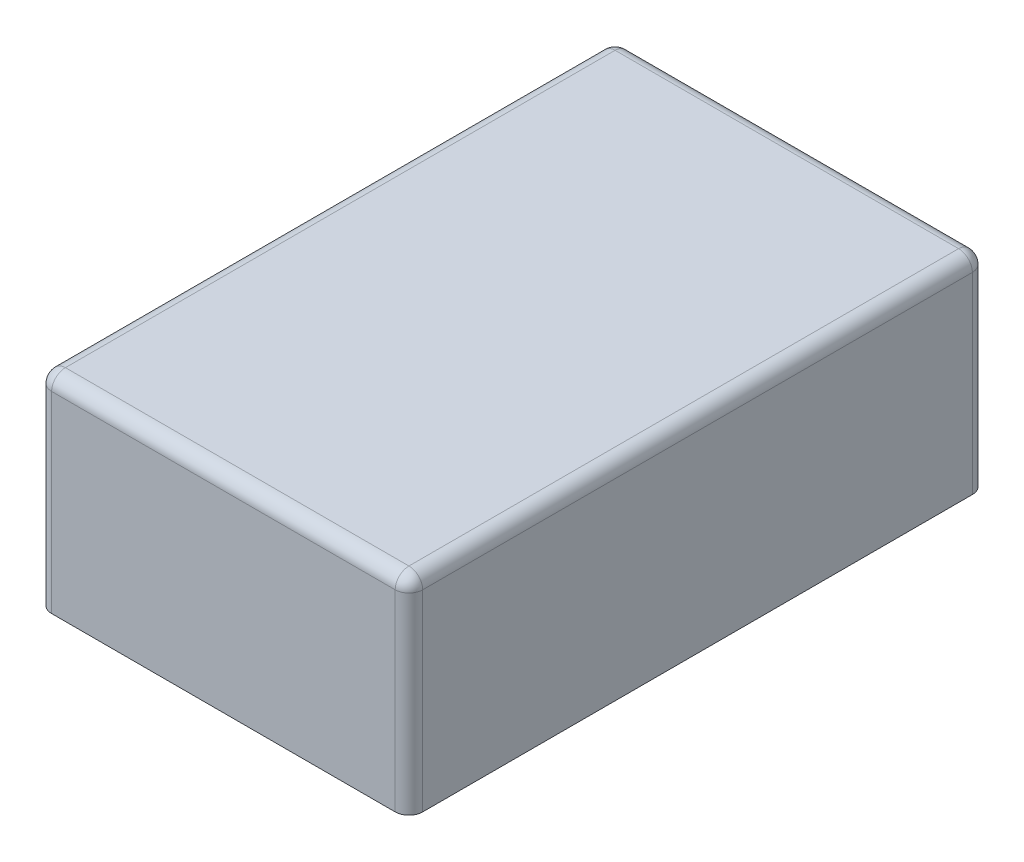
ISO-10303-21;
HEADER;
FILE_DESCRIPTION(('STEP AP214'),'2;1');
FILE_NAME('part.step','',(''),(''),'','','');
FILE_SCHEMA(('AUTOMOTIVE_DESIGN { 1 0 10303 214 1 1 1 1 }'));
ENDSEC;
DATA;
#1=APPLICATION_CONTEXT('core data for automotive mechanical design processes');
#2=APPLICATION_PROTOCOL_DEFINITION('international standard','automotive_design',2000,#1);
#3=PRODUCT_CONTEXT('',#1,'mechanical');
#4=PRODUCT('Part','Part','',(#3));
#5=PRODUCT_RELATED_PRODUCT_CATEGORY('part','',(#4));
#6=PRODUCT_DEFINITION_FORMATION('','',#4);
#7=PRODUCT_DEFINITION_CONTEXT('part definition',#1,'design');
#8=PRODUCT_DEFINITION('design','',#6,#7);
#9=PRODUCT_DEFINITION_SHAPE('','',#8);
#10=(LENGTH_UNIT() NAMED_UNIT(*) SI_UNIT(.MILLI.,.METRE.));
#11=(NAMED_UNIT(*) PLANE_ANGLE_UNIT() SI_UNIT($,.RADIAN.));
#12=(NAMED_UNIT(*) SI_UNIT($,.STERADIAN.) SOLID_ANGLE_UNIT());
#13=UNCERTAINTY_MEASURE_WITH_UNIT(LENGTH_MEASURE(1.E-05),#10,'distance_accuracy_value','');
#14=(GEOMETRIC_REPRESENTATION_CONTEXT(3) GLOBAL_UNCERTAINTY_ASSIGNED_CONTEXT((#13)) GLOBAL_UNIT_ASSIGNED_CONTEXT((#10,
#11,#12)) REPRESENTATION_CONTEXT('',''));
#15=CARTESIAN_POINT('',(0.,0.,0.));
#16=DIRECTION('',(0.,0.,1.));
#17=DIRECTION('',(1.,0.,0.));
#18=AXIS2_PLACEMENT_3D('',#15,#16,#17);
#19=CARTESIAN_POINT('',(0.,0.,0.));
#20=DIRECTION('',(0.,1.,0.));
#21=DIRECTION('',(0.,0.,1.));
#22=AXIS2_PLACEMENT_3D('',#19,#20,#21);
#23=PLANE('',#22);
#24=DIRECTION('',(0.,0.,1.));
#25=VECTOR('',#24,1.);
#26=CARTESIAN_POINT('',(-65.7571373847234,0.,-29.704647457208));
#27=LINE('',#26,#25);
#28=CARTESIAN_POINT('',(-65.7571373847234,0.,-28.704647457208));
#29=VERTEX_POINT('',#28);
#30=CARTESIAN_POINT('',(-65.7571373847234,0.,11.295352542792));
#31=VERTEX_POINT('',#30);
#32=EDGE_CURVE('E161',#29,#31,#27,.T.);
#33=ORIENTED_EDGE('',*,*,#32,.F.);
#34=CARTESIAN_POINT('',(-64.7571373847234,0.,-28.704647457208));
#35=DIRECTION('',(0.,1.,0.));
#36=DIRECTION('',(0.,0.,1.));
#37=AXIS2_PLACEMENT_3D('',#34,#35,#36);
#38=CIRCLE('',#37,1.);
#39=CARTESIAN_POINT('',(-64.7571373847234,0.,-29.704647457208));
#40=VERTEX_POINT('',#39);
#41=EDGE_CURVE('E230',#29,#40,#38,.F.);
#42=ORIENTED_EDGE('',*,*,#41,.T.);
#43=DIRECTION('',(-1.,0.,0.));
#44=VECTOR('',#43,1.);
#45=CARTESIAN_POINT('',(-65.7571373847234,0.,-29.704647457208));
#46=LINE('',#45,#44);
#47=CARTESIAN_POINT('',(-39.7571373847234,0.,-29.704647457208));
#48=VERTEX_POINT('',#47);
#49=EDGE_CURVE('E175',#48,#40,#46,.T.);
#50=ORIENTED_EDGE('',*,*,#49,.F.);
#51=CARTESIAN_POINT('',(-39.7571373847234,0.,-28.704647457208));
#52=DIRECTION('',(0.,1.,0.));
#53=DIRECTION('',(0.,0.,1.));
#54=AXIS2_PLACEMENT_3D('',#51,#52,#53);
#55=CIRCLE('',#54,1.);
#56=CARTESIAN_POINT('',(-38.7571373847234,0.,-28.704647457208));
#57=VERTEX_POINT('',#56);
#58=EDGE_CURVE('E228',#48,#57,#55,.F.);
#59=ORIENTED_EDGE('',*,*,#58,.T.);
#60=DIRECTION('',(0.,0.,-1.));
#61=VECTOR('',#60,1.);
#62=CARTESIAN_POINT('',(-38.7571373847234,0.,-29.704647457208));
#63=LINE('',#62,#61);
#64=CARTESIAN_POINT('',(-38.7571373847234,0.,11.295352542792));
#65=VERTEX_POINT('',#64);
#66=EDGE_CURVE('E172',#65,#57,#63,.T.);
#67=ORIENTED_EDGE('',*,*,#66,.F.);
#68=CARTESIAN_POINT('',(-39.7571373847234,0.,11.295352542792));
#69=DIRECTION('',(0.,1.,0.));
#70=DIRECTION('',(0.,0.,1.));
#71=AXIS2_PLACEMENT_3D('',#68,#69,#70);
#72=CIRCLE('',#71,1.);
#73=CARTESIAN_POINT('',(-39.7571373847234,0.,12.295352542792));
#74=VERTEX_POINT('',#73);
#75=EDGE_CURVE('E52',#65,#74,#72,.F.);
#76=ORIENTED_EDGE('',*,*,#75,.T.);
#77=DIRECTION('',(1.,0.,0.));
#78=VECTOR('',#77,1.);
#79=CARTESIAN_POINT('',(-65.7571373847234,0.,12.295352542792));
#80=LINE('',#79,#78);
#81=CARTESIAN_POINT('',(-64.7571373847234,0.,12.295352542792));
#82=VERTEX_POINT('',#81);
#83=EDGE_CURVE('E165',#82,#74,#80,.T.);
#84=ORIENTED_EDGE('',*,*,#83,.F.);
#85=CARTESIAN_POINT('',(-64.7571373847234,0.,11.295352542792));
#86=DIRECTION('',(0.,1.,0.));
#87=DIRECTION('',(0.,0.,1.));
#88=AXIS2_PLACEMENT_3D('',#85,#86,#87);
#89=CIRCLE('',#88,1.);
#90=EDGE_CURVE('E226',#82,#31,#89,.F.);
#91=ORIENTED_EDGE('',*,*,#90,.T.);
#92=EDGE_LOOP('',(#33,#42,#50,#59,#67,#76,#84,#91));
#93=FACE_BOUND('',#92,.T.);
#94=DIRECTION('',(0.,0.,-1.));
#95=VECTOR('',#94,1.);
#96=CARTESIAN_POINT('',(-39.7571373847234,0.,-28.704647457208));
#97=LINE('',#96,#95);
#98=CARTESIAN_POINT('',(-39.7571373847234,0.,11.295352542792));
#99=VERTEX_POINT('',#98);
#100=CARTESIAN_POINT('',(-39.7571373847234,0.,-28.704647457208));
#101=VERTEX_POINT('',#100);
#102=EDGE_CURVE('E244',#99,#101,#97,.T.);
#103=ORIENTED_EDGE('',*,*,#102,.T.);
#104=DIRECTION('',(-1.,0.,0.));
#105=VECTOR('',#104,1.);
#106=CARTESIAN_POINT('',(-64.7571373847234,0.,-28.704647457208));
#107=LINE('',#106,#105);
#108=CARTESIAN_POINT('',(-64.7571373847234,0.,-28.704647457208));
#109=VERTEX_POINT('',#108);
#110=EDGE_CURVE('E160',#101,#109,#107,.T.);
#111=ORIENTED_EDGE('',*,*,#110,.T.);
#112=DIRECTION('',(0.,0.,1.));
#113=VECTOR('',#112,1.);
#114=CARTESIAN_POINT('',(-64.7571373847234,0.,-28.704647457208));
#115=LINE('',#114,#113);
#116=CARTESIAN_POINT('',(-64.7571373847234,0.,11.295352542792));
#117=VERTEX_POINT('',#116);
#118=EDGE_CURVE('E506',#109,#117,#115,.T.);
#119=ORIENTED_EDGE('',*,*,#118,.T.);
#120=DIRECTION('',(1.,0.,0.));
#121=VECTOR('',#120,1.);
#122=CARTESIAN_POINT('',(-64.7571373847234,0.,11.295352542792));
#123=LINE('',#122,#121);
#124=EDGE_CURVE('E156',#117,#99,#123,.T.);
#125=ORIENTED_EDGE('',*,*,#124,.T.);
#126=EDGE_LOOP('',(#103,#111,#119,#125));
#127=FACE_BOUND('',#126,.T.);
#128=ADVANCED_FACE('F35',(#93,#127),#23,.F.);
#129=CARTESIAN_POINT('',(-65.7571373847234,15.,-29.704647457208));
#130=DIRECTION('',(1.,0.,0.));
#131=DIRECTION('',(0.,0.,-1.));
#132=AXIS2_PLACEMENT_3D('',#129,#130,#131);
#133=PLANE('',#132);
#134=DIRECTION('',(0.,0.,1.));
#135=VECTOR('',#134,1.);
#136=CARTESIAN_POINT('',(-65.7571373847234,14.,-29.704647457208));
#137=LINE('',#136,#135);
#138=CARTESIAN_POINT('',(-65.7571373847234,14.,11.295352542792));
#139=VERTEX_POINT('',#138);
#140=CARTESIAN_POINT('',(-65.7571373847234,14.,-28.704647457208));
#141=VERTEX_POINT('',#140);
#142=EDGE_CURVE('E198',#139,#141,#137,.F.);
#143=ORIENTED_EDGE('',*,*,#142,.T.);
#144=DIRECTION('',(0.,-1.,0.));
#145=VECTOR('',#144,1.);
#146=CARTESIAN_POINT('',(-65.7571373847234,15.,-28.704647457208));
#147=LINE('',#146,#145);
#148=EDGE_CURVE('E223',#141,#29,#147,.T.);
#149=ORIENTED_EDGE('',*,*,#148,.T.);
#150=ORIENTED_EDGE('',*,*,#32,.T.);
#151=DIRECTION('',(0.,-1.,0.));
#152=VECTOR('',#151,1.);
#153=CARTESIAN_POINT('',(-65.7571373847234,15.,11.295352542792));
#154=LINE('',#153,#152);
#155=EDGE_CURVE('E221',#31,#139,#154,.F.);
#156=ORIENTED_EDGE('',*,*,#155,.T.);
#157=EDGE_LOOP('',(#143,#149,#150,#156));
#158=FACE_BOUND('',#157,.T.);
#159=ADVANCED_FACE('F301',(#158),#133,.F.);
#160=CARTESIAN_POINT('',(-65.7571373847234,15.,12.295352542792));
#161=DIRECTION('',(0.,0.,-1.));
#162=DIRECTION('',(-1.,0.,0.));
#163=AXIS2_PLACEMENT_3D('',#160,#161,#162);
#164=PLANE('',#163);
#165=DIRECTION('',(1.,0.,0.));
#166=VECTOR('',#165,1.);
#167=CARTESIAN_POINT('',(-65.7571373847234,14.,12.295352542792));
#168=LINE('',#167,#166);
#169=CARTESIAN_POINT('',(-39.7571373847234,14.,12.295352542792));
#170=VERTEX_POINT('',#169);
#171=CARTESIAN_POINT('',(-64.7571373847234,14.,12.295352542792));
#172=VERTEX_POINT('',#171);
#173=EDGE_CURVE('E196',#170,#172,#168,.F.);
#174=ORIENTED_EDGE('',*,*,#173,.T.);
#175=DIRECTION('',(0.,-1.,0.));
#176=VECTOR('',#175,1.);
#177=CARTESIAN_POINT('',(-64.7571373847234,15.,12.295352542792));
#178=LINE('',#177,#176);
#179=EDGE_CURVE('E11',#172,#82,#178,.T.);
#180=ORIENTED_EDGE('',*,*,#179,.T.);
#181=ORIENTED_EDGE('',*,*,#83,.T.);
#182=DIRECTION('',(0.,-1.,0.));
#183=VECTOR('',#182,1.);
#184=CARTESIAN_POINT('',(-39.7571373847234,15.,12.295352542792));
#185=LINE('',#184,#183);
#186=EDGE_CURVE('E44',#74,#170,#185,.F.);
#187=ORIENTED_EDGE('',*,*,#186,.T.);
#188=EDGE_LOOP('',(#174,#180,#181,#187));
#189=FACE_BOUND('',#188,.T.);
#190=ADVANCED_FACE('F292',(#189),#164,.F.);
#191=CARTESIAN_POINT('',(-38.7571373847234,15.,-29.704647457208));
#192=DIRECTION('',(-1.,0.,0.));
#193=DIRECTION('',(0.,0.,1.));
#194=AXIS2_PLACEMENT_3D('',#191,#192,#193);
#195=PLANE('',#194);
#196=ORIENTED_EDGE('',*,*,#66,.T.);
#197=DIRECTION('',(0.,-1.,0.));
#198=VECTOR('',#197,1.);
#199=CARTESIAN_POINT('',(-38.7571373847234,15.,-28.704647457208));
#200=LINE('',#199,#198);
#201=CARTESIAN_POINT('',(-38.7571373847234,14.,-28.704647457208));
#202=VERTEX_POINT('',#201);
#203=EDGE_CURVE('E238',#57,#202,#200,.F.);
#204=ORIENTED_EDGE('',*,*,#203,.T.);
#205=DIRECTION('',(0.,0.,-1.));
#206=VECTOR('',#205,1.);
#207=CARTESIAN_POINT('',(-38.7571373847234,14.,12.295352542792));
#208=LINE('',#207,#206);
#209=CARTESIAN_POINT('',(-38.7571373847234,14.,11.295352542792));
#210=VERTEX_POINT('',#209);
#211=EDGE_CURVE('E193',#202,#210,#208,.F.);
#212=ORIENTED_EDGE('',*,*,#211,.T.);
#213=DIRECTION('',(0.,-1.,0.));
#214=VECTOR('',#213,1.);
#215=CARTESIAN_POINT('',(-38.7571373847234,15.,11.295352542792));
#216=LINE('',#215,#214);
#217=EDGE_CURVE('E236',#210,#65,#216,.T.);
#218=ORIENTED_EDGE('',*,*,#217,.T.);
#219=EDGE_LOOP('',(#196,#204,#212,#218));
#220=FACE_BOUND('',#219,.T.);
#221=ADVANCED_FACE('F265',(#220),#195,.F.);
#222=CARTESIAN_POINT('',(-65.7571373847234,15.,-29.704647457208));
#223=DIRECTION('',(0.,0.,1.));
#224=DIRECTION('',(1.,0.,0.));
#225=AXIS2_PLACEMENT_3D('',#222,#223,#224);
#226=PLANE('',#225);
#227=ORIENTED_EDGE('',*,*,#49,.T.);
#228=DIRECTION('',(0.,-1.,0.));
#229=VECTOR('',#228,1.);
#230=CARTESIAN_POINT('',(-64.7571373847234,15.,-29.704647457208));
#231=LINE('',#230,#229);
#232=CARTESIAN_POINT('',(-64.7571373847234,14.,-29.704647457208));
#233=VERTEX_POINT('',#232);
#234=EDGE_CURVE('E234',#40,#233,#231,.F.);
#235=ORIENTED_EDGE('',*,*,#234,.T.);
#236=DIRECTION('',(-1.,0.,0.));
#237=VECTOR('',#236,1.);
#238=CARTESIAN_POINT('',(-38.7571373847234,14.,-29.704647457208));
#239=LINE('',#238,#237);
#240=CARTESIAN_POINT('',(-39.7571373847234,14.,-29.704647457208));
#241=VERTEX_POINT('',#240);
#242=EDGE_CURVE('E190',#233,#241,#239,.F.);
#243=ORIENTED_EDGE('',*,*,#242,.T.);
#244=DIRECTION('',(0.,-1.,0.));
#245=VECTOR('',#244,1.);
#246=CARTESIAN_POINT('',(-39.7571373847234,15.,-29.704647457208));
#247=LINE('',#246,#245);
#248=EDGE_CURVE('E232',#241,#48,#247,.T.);
#249=ORIENTED_EDGE('',*,*,#248,.T.);
#250=EDGE_LOOP('',(#227,#235,#243,#249));
#251=FACE_BOUND('',#250,.T.);
#252=ADVANCED_FACE('F325',(#251),#226,.F.);
#253=CARTESIAN_POINT('',(0.,15.,0.));
#254=DIRECTION('',(0.,1.,0.));
#255=DIRECTION('',(0.,0.,1.));
#256=AXIS2_PLACEMENT_3D('',#253,#254,#255);
#257=PLANE('',#256);
#258=DIRECTION('',(0.,0.,-1.));
#259=VECTOR('',#258,1.);
#260=CARTESIAN_POINT('',(-39.7571373847234,15.,-29.704647457208));
#261=LINE('',#260,#259);
#262=CARTESIAN_POINT('',(-39.7571373847234,15.,11.295352542792));
#263=VERTEX_POINT('',#262);
#264=CARTESIAN_POINT('',(-39.7571373847234,15.,-28.704647457208));
#265=VERTEX_POINT('',#264);
#266=EDGE_CURVE('E184',#263,#265,#261,.T.);
#267=ORIENTED_EDGE('',*,*,#266,.T.);
#268=DIRECTION('',(-1.,0.,0.));
#269=VECTOR('',#268,1.);
#270=CARTESIAN_POINT('',(-65.7571373847234,15.,-28.704647457208));
#271=LINE('',#270,#269);
#272=CARTESIAN_POINT('',(-64.7571373847234,15.,-28.704647457208));
#273=VERTEX_POINT('',#272);
#274=EDGE_CURVE('E187',#265,#273,#271,.T.);
#275=ORIENTED_EDGE('',*,*,#274,.T.);
#276=DIRECTION('',(0.,0.,1.));
#277=VECTOR('',#276,1.);
#278=CARTESIAN_POINT('',(-64.7571373847234,15.,12.295352542792));
#279=LINE('',#278,#277);
#280=CARTESIAN_POINT('',(-64.7571373847234,15.,11.295352542792));
#281=VERTEX_POINT('',#280);
#282=EDGE_CURVE('E178',#273,#281,#279,.T.);
#283=ORIENTED_EDGE('',*,*,#282,.T.);
#284=DIRECTION('',(1.,0.,0.));
#285=VECTOR('',#284,1.);
#286=CARTESIAN_POINT('',(-38.7571373847234,15.,11.295352542792));
#287=LINE('',#286,#285);
#288=EDGE_CURVE('E181',#281,#263,#287,.T.);
#289=ORIENTED_EDGE('',*,*,#288,.T.);
#290=EDGE_LOOP('',(#267,#275,#283,#289));
#291=FACE_BOUND('',#290,.T.);
#292=ADVANCED_FACE('F277',(#291),#257,.T.);
#293=CARTESIAN_POINT('',(-39.7571373847234,14.,-28.704647457208));
#294=DIRECTION('',(-1.,0.,0.));
#295=DIRECTION('',(0.,0.,1.));
#296=AXIS2_PLACEMENT_3D('',#293,#294,#295);
#297=PLANE('',#296);
#298=ORIENTED_EDGE('',*,*,#102,.F.);
#299=DIRECTION('',(0.,-1.,0.));
#300=VECTOR('',#299,1.);
#301=CARTESIAN_POINT('',(-39.7571373847234,14.,11.295352542792));
#302=LINE('',#301,#300);
#303=CARTESIAN_POINT('',(-39.7571373847234,14.,11.295352542792));
#304=VERTEX_POINT('',#303);
#305=EDGE_CURVE('E155',#304,#99,#302,.T.);
#306=ORIENTED_EDGE('',*,*,#305,.F.);
#307=DIRECTION('',(0.,0.,-1.));
#308=VECTOR('',#307,1.);
#309=CARTESIAN_POINT('',(-39.7571373847234,14.,-28.704647457208));
#310=LINE('',#309,#308);
#311=CARTESIAN_POINT('',(-39.7571373847234,14.,-28.704647457208));
#312=VERTEX_POINT('',#311);
#313=EDGE_CURVE('E142',#304,#312,#310,.T.);
#314=ORIENTED_EDGE('',*,*,#313,.T.);
#315=DIRECTION('',(0.,-1.,0.));
#316=VECTOR('',#315,1.);
#317=CARTESIAN_POINT('',(-39.7571373847234,14.,-28.704647457208));
#318=LINE('',#317,#316);
#319=EDGE_CURVE('E152',#312,#101,#318,.T.);
#320=ORIENTED_EDGE('',*,*,#319,.T.);
#321=EDGE_LOOP('',(#298,#306,#314,#320));
#322=FACE_BOUND('',#321,.T.);
#323=ADVANCED_FACE('F151',(#322),#297,.T.);
#324=CARTESIAN_POINT('',(-64.7571373847234,14.,-28.704647457208));
#325=DIRECTION('',(0.,0.,1.));
#326=DIRECTION('',(1.,0.,0.));
#327=AXIS2_PLACEMENT_3D('',#324,#325,#326);
#328=PLANE('',#327);
#329=ORIENTED_EDGE('',*,*,#110,.F.);
#330=ORIENTED_EDGE('',*,*,#319,.F.);
#331=DIRECTION('',(-1.,0.,0.));
#332=VECTOR('',#331,1.);
#333=CARTESIAN_POINT('',(-64.7571373847234,14.,-28.704647457208));
#334=LINE('',#333,#332);
#335=CARTESIAN_POINT('',(-64.7571373847234,14.,-28.704647457208));
#336=VERTEX_POINT('',#335);
#337=EDGE_CURVE('E138',#312,#336,#334,.T.);
#338=ORIENTED_EDGE('',*,*,#337,.T.);
#339=DIRECTION('',(0.,-1.,0.));
#340=VECTOR('',#339,1.);
#341=CARTESIAN_POINT('',(-64.7571373847234,14.,-28.704647457208));
#342=LINE('',#341,#340);
#343=EDGE_CURVE('E162',#336,#109,#342,.T.);
#344=ORIENTED_EDGE('',*,*,#343,.T.);
#345=EDGE_LOOP('',(#329,#330,#338,#344));
#346=FACE_BOUND('',#345,.T.);
#347=ADVANCED_FACE('F158',(#346),#328,.T.);
#348=CARTESIAN_POINT('',(-64.7571373847234,14.,-28.704647457208));
#349=DIRECTION('',(1.,0.,0.));
#350=DIRECTION('',(0.,0.,-1.));
#351=AXIS2_PLACEMENT_3D('',#348,#349,#350);
#352=PLANE('',#351);
#353=ORIENTED_EDGE('',*,*,#118,.F.);
#354=ORIENTED_EDGE('',*,*,#343,.F.);
#355=DIRECTION('',(0.,0.,1.));
#356=VECTOR('',#355,1.);
#357=CARTESIAN_POINT('',(-64.7571373847234,14.,-28.704647457208));
#358=LINE('',#357,#356);
#359=CARTESIAN_POINT('',(-64.7571373847234,14.,11.295352542792));
#360=VERTEX_POINT('',#359);
#361=EDGE_CURVE('E143',#336,#360,#358,.T.);
#362=ORIENTED_EDGE('',*,*,#361,.T.);
#363=DIRECTION('',(0.,-1.,0.));
#364=VECTOR('',#363,1.);
#365=CARTESIAN_POINT('',(-64.7571373847234,14.,11.295352542792));
#366=LINE('',#365,#364);
#367=EDGE_CURVE('E167',#360,#117,#366,.T.);
#368=ORIENTED_EDGE('',*,*,#367,.T.);
#369=EDGE_LOOP('',(#353,#354,#362,#368));
#370=FACE_BOUND('',#369,.T.);
#371=ADVANCED_FACE('F347',(#370),#352,.T.);
#372=CARTESIAN_POINT('',(-64.7571373847234,14.,11.295352542792));
#373=DIRECTION('',(0.,0.,-1.));
#374=DIRECTION('',(-1.,0.,0.));
#375=AXIS2_PLACEMENT_3D('',#372,#373,#374);
#376=PLANE('',#375);
#377=ORIENTED_EDGE('',*,*,#124,.F.);
#378=ORIENTED_EDGE('',*,*,#367,.F.);
#379=DIRECTION('',(1.,0.,0.));
#380=VECTOR('',#379,1.);
#381=CARTESIAN_POINT('',(-64.7571373847234,14.,11.295352542792));
#382=LINE('',#381,#380);
#383=EDGE_CURVE('E516',#360,#304,#382,.T.);
#384=ORIENTED_EDGE('',*,*,#383,.T.);
#385=ORIENTED_EDGE('',*,*,#305,.T.);
#386=EDGE_LOOP('',(#377,#378,#384,#385));
#387=FACE_BOUND('',#386,.T.);
#388=ADVANCED_FACE('F342',(#387),#376,.T.);
#389=CARTESIAN_POINT('',(0.,14.,0.));
#390=DIRECTION('',(0.,1.,0.));
#391=DIRECTION('',(0.,0.,1.));
#392=AXIS2_PLACEMENT_3D('',#389,#390,#391);
#393=PLANE('',#392);
#394=ORIENTED_EDGE('',*,*,#313,.F.);
#395=ORIENTED_EDGE('',*,*,#383,.F.);
#396=ORIENTED_EDGE('',*,*,#361,.F.);
#397=ORIENTED_EDGE('',*,*,#337,.F.);
#398=EDGE_LOOP('',(#394,#395,#396,#397));
#399=FACE_BOUND('',#398,.T.);
#400=ADVANCED_FACE('F140',(#399),#393,.F.);
#401=CARTESIAN_POINT('',(0.,14.,11.295352542792));
#402=DIRECTION('',(-1.,0.,0.));
#403=DIRECTION('',(0.,0.,1.));
#404=AXIS2_PLACEMENT_3D('',#401,#402,#403);
#405=CYLINDRICAL_SURFACE('',#404,1.);
#406=ORIENTED_EDGE('',*,*,#288,.F.);
#407=CARTESIAN_POINT('',(-64.7571373847234,14.,11.295352542792));
#408=DIRECTION('',(-1.,0.,0.));
#409=DIRECTION('',(0.,0.,1.));
#410=AXIS2_PLACEMENT_3D('',#407,#408,#409);
#411=CIRCLE('',#410,1.);
#412=EDGE_CURVE('E219',#281,#172,#411,.F.);
#413=ORIENTED_EDGE('',*,*,#412,.T.);
#414=ORIENTED_EDGE('',*,*,#173,.F.);
#415=CARTESIAN_POINT('',(-39.7571373847234,14.,11.295352542792));
#416=DIRECTION('',(-1.,0.,0.));
#417=DIRECTION('',(0.,0.,1.));
#418=AXIS2_PLACEMENT_3D('',#415,#416,#417);
#419=CIRCLE('',#418,1.);
#420=EDGE_CURVE('E217',#170,#263,#419,.T.);
#421=ORIENTED_EDGE('',*,*,#420,.T.);
#422=EDGE_LOOP('',(#406,#413,#414,#421));
#423=FACE_BOUND('',#422,.T.);
#424=ADVANCED_FACE('F290',(#423),#405,.T.);
#425=CARTESIAN_POINT('',(-39.7571373847234,14.,0.));
#426=DIRECTION('',(0.,0.,1.));
#427=DIRECTION('',(1.,0.,0.));
#428=AXIS2_PLACEMENT_3D('',#425,#426,#427);
#429=CYLINDRICAL_SURFACE('',#428,1.);
#430=ORIENTED_EDGE('',*,*,#211,.F.);
#431=CARTESIAN_POINT('',(-39.7571373847234,14.,-28.704647457208));
#432=DIRECTION('',(0.,0.,1.));
#433=DIRECTION('',(1.,0.,0.));
#434=AXIS2_PLACEMENT_3D('',#431,#432,#433);
#435=CIRCLE('',#434,1.);
#436=EDGE_CURVE('E215',#202,#265,#435,.T.);
#437=ORIENTED_EDGE('',*,*,#436,.T.);
#438=ORIENTED_EDGE('',*,*,#266,.F.);
#439=CARTESIAN_POINT('',(-39.7571373847234,14.,11.295352542792));
#440=DIRECTION('',(0.,0.,1.));
#441=DIRECTION('',(1.,0.,0.));
#442=AXIS2_PLACEMENT_3D('',#439,#440,#441);
#443=CIRCLE('',#442,1.);
#444=EDGE_CURVE('E212',#263,#210,#443,.F.);
#445=ORIENTED_EDGE('',*,*,#444,.T.);
#446=EDGE_LOOP('',(#430,#437,#438,#445));
#447=FACE_BOUND('',#446,.T.);
#448=ADVANCED_FACE('F263',(#447),#429,.T.);
#449=CARTESIAN_POINT('',(-64.7571373847234,14.,0.));
#450=DIRECTION('',(0.,0.,-1.));
#451=DIRECTION('',(-1.,0.,0.));
#452=AXIS2_PLACEMENT_3D('',#449,#450,#451);
#453=CYLINDRICAL_SURFACE('',#452,1.);
#454=ORIENTED_EDGE('',*,*,#282,.F.);
#455=CARTESIAN_POINT('',(-64.7571373847234,14.,-28.704647457208));
#456=DIRECTION('',(0.,0.,-1.));
#457=DIRECTION('',(-1.,0.,0.));
#458=AXIS2_PLACEMENT_3D('',#455,#456,#457);
#459=CIRCLE('',#458,1.);
#460=EDGE_CURVE('E210',#273,#141,#459,.F.);
#461=ORIENTED_EDGE('',*,*,#460,.T.);
#462=ORIENTED_EDGE('',*,*,#142,.F.);
#463=CARTESIAN_POINT('',(-64.7571373847234,14.,11.295352542792));
#464=DIRECTION('',(0.,0.,-1.));
#465=DIRECTION('',(-1.,0.,0.));
#466=AXIS2_PLACEMENT_3D('',#463,#464,#465);
#467=CIRCLE('',#466,1.);
#468=EDGE_CURVE('E207',#139,#281,#467,.T.);
#469=ORIENTED_EDGE('',*,*,#468,.T.);
#470=EDGE_LOOP('',(#454,#461,#462,#469));
#471=FACE_BOUND('',#470,.T.);
#472=ADVANCED_FACE('F287',(#471),#453,.T.);
#473=CARTESIAN_POINT('',(0.,14.,-28.704647457208));
#474=DIRECTION('',(1.,0.,0.));
#475=DIRECTION('',(0.,0.,-1.));
#476=AXIS2_PLACEMENT_3D('',#473,#474,#475);
#477=CYLINDRICAL_SURFACE('',#476,1.);
#478=ORIENTED_EDGE('',*,*,#242,.F.);
#479=CARTESIAN_POINT('',(-64.7571373847234,14.,-28.704647457208));
#480=DIRECTION('',(1.,0.,0.));
#481=DIRECTION('',(0.,0.,-1.));
#482=AXIS2_PLACEMENT_3D('',#479,#480,#481);
#483=CIRCLE('',#482,1.);
#484=EDGE_CURVE('E204',#233,#273,#483,.T.);
#485=ORIENTED_EDGE('',*,*,#484,.T.);
#486=ORIENTED_EDGE('',*,*,#274,.F.);
#487=CARTESIAN_POINT('',(-39.7571373847234,14.,-28.704647457208));
#488=DIRECTION('',(1.,0.,0.));
#489=DIRECTION('',(0.,0.,-1.));
#490=AXIS2_PLACEMENT_3D('',#487,#488,#489);
#491=CIRCLE('',#490,1.);
#492=EDGE_CURVE('E201',#265,#241,#491,.F.);
#493=ORIENTED_EDGE('',*,*,#492,.T.);
#494=EDGE_LOOP('',(#478,#485,#486,#493));
#495=FACE_BOUND('',#494,.T.);
#496=ADVANCED_FACE('F281',(#495),#477,.T.);
#497=CARTESIAN_POINT('',(-64.7571373847234,15.,-28.704647457208));
#498=DIRECTION('',(0.,-1.,0.));
#499=DIRECTION('',(0.,0.,-1.));
#500=AXIS2_PLACEMENT_3D('',#497,#498,#499);
#501=CYLINDRICAL_SURFACE('',#500,1.);
#502=ORIENTED_EDGE('',*,*,#41,.F.);
#503=ORIENTED_EDGE('',*,*,#148,.F.);
#504=CARTESIAN_POINT('',(-64.7571373847234,14.,-28.704647457208));
#505=DIRECTION('',(0.,1.,0.));
#506=DIRECTION('',(0.,0.,1.));
#507=AXIS2_PLACEMENT_3D('',#504,#505,#506);
#508=CIRCLE('',#507,1.);
#509=EDGE_CURVE('E241',#233,#141,#508,.T.);
#510=ORIENTED_EDGE('',*,*,#509,.F.);
#511=ORIENTED_EDGE('',*,*,#234,.F.);
#512=EDGE_LOOP('',(#502,#503,#510,#511));
#513=FACE_BOUND('',#512,.T.);
#514=ADVANCED_FACE('F304',(#513),#501,.T.);
#515=CARTESIAN_POINT('',(-64.7571373847234,14.,-28.704647457208));
#516=DIRECTION('',(0.,0.,1.));
#517=DIRECTION('',(1.,0.,0.));
#518=AXIS2_PLACEMENT_3D('',#515,#516,#517);
#519=SPHERICAL_SURFACE('',#518,1.);
#520=ORIENTED_EDGE('',*,*,#509,.T.);
#521=ORIENTED_EDGE('',*,*,#460,.F.);
#522=ORIENTED_EDGE('',*,*,#484,.F.);
#523=EDGE_LOOP('',(#520,#521,#522));
#524=FACE_BOUND('',#523,.T.);
#525=ADVANCED_FACE('F306',(#524),#519,.T.);
#526=CARTESIAN_POINT('',(-39.7571373847234,15.,-28.704647457208));
#527=DIRECTION('',(0.,-1.,0.));
#528=DIRECTION('',(0.,0.,-1.));
#529=AXIS2_PLACEMENT_3D('',#526,#527,#528);
#530=CYLINDRICAL_SURFACE('',#529,1.);
#531=ORIENTED_EDGE('',*,*,#58,.F.);
#532=ORIENTED_EDGE('',*,*,#248,.F.);
#533=CARTESIAN_POINT('',(-39.7571373847234,14.,-28.704647457208));
#534=DIRECTION('',(0.,1.,0.));
#535=DIRECTION('',(0.,0.,1.));
#536=AXIS2_PLACEMENT_3D('',#533,#534,#535);
#537=CIRCLE('',#536,1.);
#538=EDGE_CURVE('E245',#202,#241,#537,.T.);
#539=ORIENTED_EDGE('',*,*,#538,.F.);
#540=ORIENTED_EDGE('',*,*,#203,.F.);
#541=EDGE_LOOP('',(#531,#532,#539,#540));
#542=FACE_BOUND('',#541,.T.);
#543=ADVANCED_FACE('F270',(#542),#530,.T.);
#544=CARTESIAN_POINT('',(-39.7571373847234,14.,-28.704647457208));
#545=DIRECTION('',(0.,0.,1.));
#546=DIRECTION('',(1.,0.,0.));
#547=AXIS2_PLACEMENT_3D('',#544,#545,#546);
#548=SPHERICAL_SURFACE('',#547,1.);
#549=ORIENTED_EDGE('',*,*,#492,.F.);
#550=ORIENTED_EDGE('',*,*,#436,.F.);
#551=ORIENTED_EDGE('',*,*,#538,.T.);
#552=EDGE_LOOP('',(#549,#550,#551));
#553=FACE_BOUND('',#552,.T.);
#554=ADVANCED_FACE('F274',(#553),#548,.T.);
#555=CARTESIAN_POINT('',(-64.7571373847234,15.,11.295352542792));
#556=DIRECTION('',(0.,-1.,0.));
#557=DIRECTION('',(0.,0.,-1.));
#558=AXIS2_PLACEMENT_3D('',#555,#556,#557);
#559=CYLINDRICAL_SURFACE('',#558,1.);
#560=ORIENTED_EDGE('',*,*,#90,.F.);
#561=ORIENTED_EDGE('',*,*,#179,.F.);
#562=CARTESIAN_POINT('',(-64.7571373847234,14.,11.295352542792));
#563=DIRECTION('',(0.,1.,0.));
#564=DIRECTION('',(0.,0.,1.));
#565=AXIS2_PLACEMENT_3D('',#562,#563,#564);
#566=CIRCLE('',#565,1.);
#567=EDGE_CURVE('E246',#139,#172,#566,.T.);
#568=ORIENTED_EDGE('',*,*,#567,.F.);
#569=ORIENTED_EDGE('',*,*,#155,.F.);
#570=EDGE_LOOP('',(#560,#561,#568,#569));
#571=FACE_BOUND('',#570,.T.);
#572=ADVANCED_FACE('F295',(#571),#559,.T.);
#573=CARTESIAN_POINT('',(-64.7571373847234,14.,11.295352542792));
#574=DIRECTION('',(0.,0.,1.));
#575=DIRECTION('',(1.,0.,0.));
#576=AXIS2_PLACEMENT_3D('',#573,#574,#575);
#577=SPHERICAL_SURFACE('',#576,1.);
#578=ORIENTED_EDGE('',*,*,#567,.T.);
#579=ORIENTED_EDGE('',*,*,#412,.F.);
#580=ORIENTED_EDGE('',*,*,#468,.F.);
#581=EDGE_LOOP('',(#578,#579,#580));
#582=FACE_BOUND('',#581,.T.);
#583=ADVANCED_FACE('F462',(#582),#577,.T.);
#584=CARTESIAN_POINT('',(-39.7571373847234,15.,11.295352542792));
#585=DIRECTION('',(0.,-1.,0.));
#586=DIRECTION('',(0.,0.,-1.));
#587=AXIS2_PLACEMENT_3D('',#584,#585,#586);
#588=CYLINDRICAL_SURFACE('',#587,1.);
#589=ORIENTED_EDGE('',*,*,#75,.F.);
#590=ORIENTED_EDGE('',*,*,#217,.F.);
#591=CARTESIAN_POINT('',(-39.7571373847234,14.,11.295352542792));
#592=DIRECTION('',(0.,1.,0.));
#593=DIRECTION('',(0.,0.,1.));
#594=AXIS2_PLACEMENT_3D('',#591,#592,#593);
#595=CIRCLE('',#594,1.);
#596=EDGE_CURVE('E39',#170,#210,#595,.T.);
#597=ORIENTED_EDGE('',*,*,#596,.F.);
#598=ORIENTED_EDGE('',*,*,#186,.F.);
#599=EDGE_LOOP('',(#589,#590,#597,#598));
#600=FACE_BOUND('',#599,.T.);
#601=ADVANCED_FACE('F37',(#600),#588,.T.);
#602=CARTESIAN_POINT('',(-39.7571373847234,14.,11.295352542792));
#603=DIRECTION('',(0.,0.,1.));
#604=DIRECTION('',(1.,0.,0.));
#605=AXIS2_PLACEMENT_3D('',#602,#603,#604);
#606=SPHERICAL_SURFACE('',#605,1.);
#607=ORIENTED_EDGE('',*,*,#444,.F.);
#608=ORIENTED_EDGE('',*,*,#420,.F.);
#609=ORIENTED_EDGE('',*,*,#596,.T.);
#610=EDGE_LOOP('',(#607,#608,#609));
#611=FACE_BOUND('',#610,.T.);
#612=ADVANCED_FACE('F256',(#611),#606,.T.);
#613=CLOSED_SHELL('',(#128,#159,#190,#221,#252,#292,#323,#347,#371,#388,#400,#424,#448,#472,
#496,#514,#525,#543,#554,#572,#583,#601,#612));
#614=MANIFOLD_SOLID_BREP('B2',#613);
#615=ADVANCED_BREP_SHAPE_REPRESENTATION('',(#18,#614),#14);
#616=SHAPE_DEFINITION_REPRESENTATION(#9,#615);
ENDSEC;
END-ISO-10303-21;
